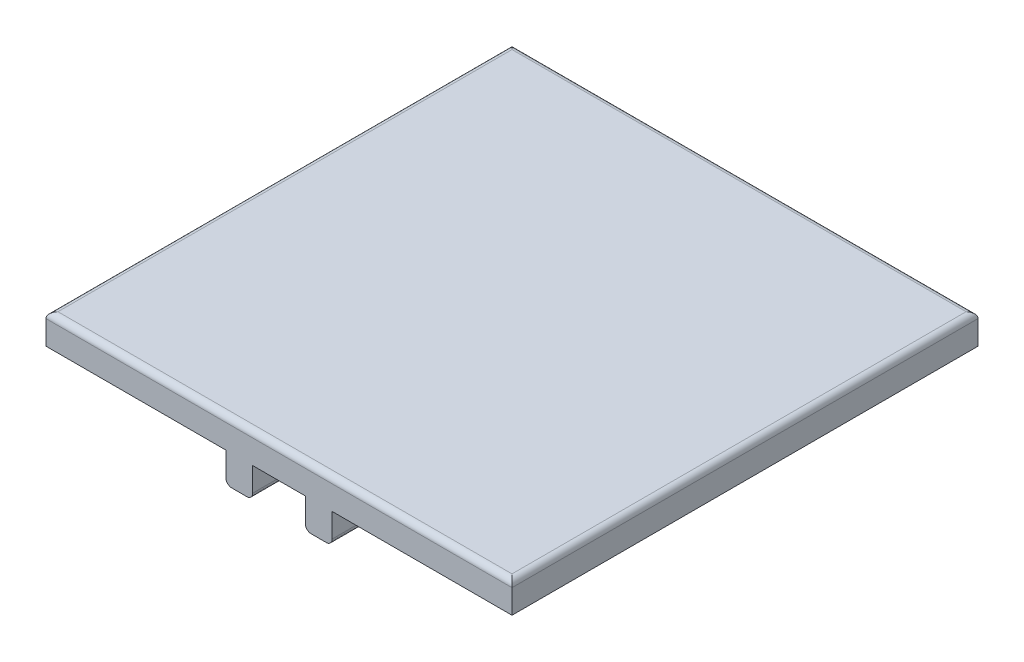
ISO-10303-21;
HEADER;
FILE_DESCRIPTION(('STEP AP214'),'2;1');
FILE_NAME('part.step','',(''),(''),'','','');
FILE_SCHEMA(('AUTOMOTIVE_DESIGN { 1 0 10303 214 1 1 1 1 }'));
ENDSEC;
DATA;
#1=APPLICATION_CONTEXT('core data for automotive mechanical design processes');
#2=APPLICATION_PROTOCOL_DEFINITION('international standard','automotive_design',2000,#1);
#3=PRODUCT_CONTEXT('',#1,'mechanical');
#4=PRODUCT('Part','Part','',(#3));
#5=PRODUCT_RELATED_PRODUCT_CATEGORY('part','',(#4));
#6=PRODUCT_DEFINITION_FORMATION('','',#4);
#7=PRODUCT_DEFINITION_CONTEXT('part definition',#1,'design');
#8=PRODUCT_DEFINITION('design','',#6,#7);
#9=PRODUCT_DEFINITION_SHAPE('','',#8);
#10=(LENGTH_UNIT() NAMED_UNIT(*) SI_UNIT(.MILLI.,.METRE.));
#11=(NAMED_UNIT(*) PLANE_ANGLE_UNIT() SI_UNIT($,.RADIAN.));
#12=(NAMED_UNIT(*) SI_UNIT($,.STERADIAN.) SOLID_ANGLE_UNIT());
#13=UNCERTAINTY_MEASURE_WITH_UNIT(LENGTH_MEASURE(1.E-05),#10,'distance_accuracy_value','');
#14=(GEOMETRIC_REPRESENTATION_CONTEXT(3) GLOBAL_UNCERTAINTY_ASSIGNED_CONTEXT((#13)) GLOBAL_UNIT_ASSIGNED_CONTEXT((#10,
#11,#12)) REPRESENTATION_CONTEXT('',''));
#15=CARTESIAN_POINT('',(0.,0.,0.));
#16=DIRECTION('',(0.,0.,1.));
#17=DIRECTION('',(1.,0.,0.));
#18=AXIS2_PLACEMENT_3D('',#15,#16,#17);
#19=CARTESIAN_POINT('',(39.,0.,39.));
#20=DIRECTION('',(1.,0.,0.));
#21=DIRECTION('',(0.,0.,-1.));
#22=AXIS2_PLACEMENT_3D('',#19,#20,#21);
#23=PLANE('',#22);
#24=DIRECTION('',(0.,-1.,0.));
#25=VECTOR('',#24,1.);
#26=CARTESIAN_POINT('',(39.,0.,-39.));
#27=LINE('',#26,#25);
#28=CARTESIAN_POINT('',(39.,1.5,-39.));
#29=VERTEX_POINT('',#28);
#30=CARTESIAN_POINT('',(39.,-2.5,-39.));
#31=VERTEX_POINT('',#30);
#32=EDGE_CURVE('E223',#29,#31,#27,.T.);
#33=ORIENTED_EDGE('',*,*,#32,.F.);
#34=DIRECTION('',(0.,0.,-1.));
#35=VECTOR('',#34,1.);
#36=CARTESIAN_POINT('',(39.,1.5,39.));
#37=LINE('',#36,#35);
#38=CARTESIAN_POINT('',(39.,1.5,39.));
#39=VERTEX_POINT('',#38);
#40=EDGE_CURVE('E49',#29,#39,#37,.F.);
#41=ORIENTED_EDGE('',*,*,#40,.T.);
#42=DIRECTION('',(0.,-1.,0.));
#43=VECTOR('',#42,1.);
#44=CARTESIAN_POINT('',(39.,0.,39.));
#45=LINE('',#44,#43);
#46=CARTESIAN_POINT('',(39.,-2.5,39.));
#47=VERTEX_POINT('',#46);
#48=EDGE_CURVE('E180',#39,#47,#45,.T.);
#49=ORIENTED_EDGE('',*,*,#48,.T.);
#50=DIRECTION('',(0.,0.,-1.));
#51=VECTOR('',#50,1.);
#52=CARTESIAN_POINT('',(39.,-2.5,39.));
#53=LINE('',#52,#51);
#54=EDGE_CURVE('E202',#47,#31,#53,.T.);
#55=ORIENTED_EDGE('',*,*,#54,.T.);
#56=EDGE_LOOP('',(#33,#41,#49,#55));
#57=FACE_BOUND('',#56,.T.);
#58=ADVANCED_FACE('F40',(#57),#23,.T.);
#59=CARTESIAN_POINT('',(0.,2.5,39.));
#60=DIRECTION('',(0.,1.,0.));
#61=DIRECTION('',(0.,0.,1.));
#62=AXIS2_PLACEMENT_3D('',#59,#60,#61);
#63=PLANE('',#62);
#64=DIRECTION('',(1.,0.,0.));
#65=VECTOR('',#64,1.);
#66=CARTESIAN_POINT('',(0.,2.5,38.));
#67=LINE('',#66,#65);
#68=CARTESIAN_POINT('',(-38.,2.5,38.));
#69=VERTEX_POINT('',#68);
#70=CARTESIAN_POINT('',(38.,2.5,38.));
#71=VERTEX_POINT('',#70);
#72=EDGE_CURVE('E295',#69,#71,#67,.T.);
#73=ORIENTED_EDGE('',*,*,#72,.T.);
#74=DIRECTION('',(0.,0.,-1.));
#75=VECTOR('',#74,1.);
#76=CARTESIAN_POINT('',(38.,2.5,39.));
#77=LINE('',#76,#75);
#78=CARTESIAN_POINT('',(38.,2.5,-38.));
#79=VERTEX_POINT('',#78);
#80=EDGE_CURVE('E300',#71,#79,#77,.T.);
#81=ORIENTED_EDGE('',*,*,#80,.T.);
#82=DIRECTION('',(1.,0.,0.));
#83=VECTOR('',#82,1.);
#84=CARTESIAN_POINT('',(-39.,2.5,-38.));
#85=LINE('',#84,#83);
#86=CARTESIAN_POINT('',(-38.,2.5,-38.));
#87=VERTEX_POINT('',#86);
#88=EDGE_CURVE('E64',#79,#87,#85,.F.);
#89=ORIENTED_EDGE('',*,*,#88,.T.);
#90=DIRECTION('',(0.,0.,-1.));
#91=VECTOR('',#90,1.);
#92=CARTESIAN_POINT('',(-38.,2.5,39.));
#93=LINE('',#92,#91);
#94=EDGE_CURVE('E297',#87,#69,#93,.F.);
#95=ORIENTED_EDGE('',*,*,#94,.T.);
#96=EDGE_LOOP('',(#73,#81,#89,#95));
#97=FACE_BOUND('',#96,.T.);
#98=ADVANCED_FACE('F374',(#97),#63,.T.);
#99=CARTESIAN_POINT('',(-39.,0.,39.));
#100=DIRECTION('',(1.,0.,0.));
#101=DIRECTION('',(0.,0.,-1.));
#102=AXIS2_PLACEMENT_3D('',#99,#100,#101);
#103=PLANE('',#102);
#104=DIRECTION('',(0.,-1.,0.));
#105=VECTOR('',#104,1.);
#106=CARTESIAN_POINT('',(-39.,0.,39.));
#107=LINE('',#106,#105);
#108=CARTESIAN_POINT('',(-39.,1.5,39.));
#109=VERTEX_POINT('',#108);
#110=CARTESIAN_POINT('',(-39.,-2.5,39.));
#111=VERTEX_POINT('',#110);
#112=EDGE_CURVE('E167',#109,#111,#107,.T.);
#113=ORIENTED_EDGE('',*,*,#112,.F.);
#114=DIRECTION('',(0.,0.,-1.));
#115=VECTOR('',#114,1.);
#116=CARTESIAN_POINT('',(-39.,1.5,-39.));
#117=LINE('',#116,#115);
#118=CARTESIAN_POINT('',(-39.,1.5,-39.));
#119=VERTEX_POINT('',#118);
#120=EDGE_CURVE('E11',#109,#119,#117,.T.);
#121=ORIENTED_EDGE('',*,*,#120,.T.);
#122=DIRECTION('',(0.,-1.,0.));
#123=VECTOR('',#122,1.);
#124=CARTESIAN_POINT('',(-39.,0.,-39.));
#125=LINE('',#124,#123);
#126=CARTESIAN_POINT('',(-39.,-2.5,-39.));
#127=VERTEX_POINT('',#126);
#128=EDGE_CURVE('E186',#119,#127,#125,.T.);
#129=ORIENTED_EDGE('',*,*,#128,.T.);
#130=DIRECTION('',(0.,0.,-1.));
#131=VECTOR('',#130,1.);
#132=CARTESIAN_POINT('',(-39.,-2.5,39.));
#133=LINE('',#132,#131);
#134=EDGE_CURVE('E183',#111,#127,#133,.T.);
#135=ORIENTED_EDGE('',*,*,#134,.F.);
#136=EDGE_LOOP('',(#113,#121,#129,#135));
#137=FACE_BOUND('',#136,.T.);
#138=ADVANCED_FACE('F184',(#137),#103,.F.);
#139=CARTESIAN_POINT('',(0.,-2.5,39.));
#140=DIRECTION('',(0.,1.,0.));
#141=DIRECTION('',(0.,0.,1.));
#142=AXIS2_PLACEMENT_3D('',#139,#140,#141);
#143=PLANE('',#142);
#144=DIRECTION('',(1.,0.,0.));
#145=VECTOR('',#144,1.);
#146=CARTESIAN_POINT('',(0.,-2.5,-39.));
#147=LINE('',#146,#145);
#148=CARTESIAN_POINT('',(-8.9,-2.5,-39.));
#149=VERTEX_POINT('',#148);
#150=EDGE_CURVE('E226',#127,#149,#147,.T.);
#151=ORIENTED_EDGE('',*,*,#150,.T.);
#152=DIRECTION('',(0.,0.,-1.));
#153=VECTOR('',#152,1.);
#154=CARTESIAN_POINT('',(-8.9,-2.5,39.));
#155=LINE('',#154,#153);
#156=CARTESIAN_POINT('',(-8.9,-2.5,39.));
#157=VERTEX_POINT('',#156);
#158=EDGE_CURVE('E190',#157,#149,#155,.T.);
#159=ORIENTED_EDGE('',*,*,#158,.F.);
#160=DIRECTION('',(1.,0.,0.));
#161=VECTOR('',#160,1.);
#162=CARTESIAN_POINT('',(0.,-2.5,39.));
#163=LINE('',#162,#161);
#164=EDGE_CURVE('E173',#111,#157,#163,.T.);
#165=ORIENTED_EDGE('',*,*,#164,.F.);
#166=ORIENTED_EDGE('',*,*,#134,.T.);
#167=EDGE_LOOP('',(#151,#159,#165,#166));
#168=FACE_BOUND('',#167,.T.);
#169=ADVANCED_FACE('F192',(#168),#143,.F.);
#170=CARTESIAN_POINT('',(-8.9,0.,39.));
#171=DIRECTION('',(1.,0.,0.));
#172=DIRECTION('',(0.,1.,0.));
#173=AXIS2_PLACEMENT_3D('',#170,#171,#172);
#174=PLANE('',#173);
#175=DIRECTION('',(0.,-1.,0.));
#176=VECTOR('',#175,1.);
#177=CARTESIAN_POINT('',(-8.9,0.,-39.));
#178=LINE('',#177,#176);
#179=CARTESIAN_POINT('',(-8.9,-6.5,-39.));
#180=VERTEX_POINT('',#179);
#181=EDGE_CURVE('E228',#149,#180,#178,.T.);
#182=ORIENTED_EDGE('',*,*,#181,.T.);
#183=DIRECTION('',(0.,0.,-1.));
#184=VECTOR('',#183,1.);
#185=CARTESIAN_POINT('',(-8.9,-6.5,39.));
#186=LINE('',#185,#184);
#187=CARTESIAN_POINT('',(-8.9,-6.5,39.));
#188=VERTEX_POINT('',#187);
#189=EDGE_CURVE('E293',#180,#188,#186,.F.);
#190=ORIENTED_EDGE('',*,*,#189,.T.);
#191=DIRECTION('',(0.,-1.,0.));
#192=VECTOR('',#191,1.);
#193=CARTESIAN_POINT('',(-8.9,0.,39.));
#194=LINE('',#193,#192);
#195=EDGE_CURVE('E195',#157,#188,#194,.T.);
#196=ORIENTED_EDGE('',*,*,#195,.F.);
#197=ORIENTED_EDGE('',*,*,#158,.T.);
#198=EDGE_LOOP('',(#182,#190,#196,#197));
#199=FACE_BOUND('',#198,.T.);
#200=ADVANCED_FACE('F323',(#199),#174,.F.);
#201=CARTESIAN_POINT('',(0.,-7.5,39.));
#202=DIRECTION('',(0.,1.,0.));
#203=DIRECTION('',(-1.,0.,0.));
#204=AXIS2_PLACEMENT_3D('',#201,#202,#203);
#205=PLANE('',#204);
#206=DIRECTION('',(1.,0.,0.));
#207=VECTOR('',#206,1.);
#208=CARTESIAN_POINT('',(0.,-7.5,-39.));
#209=LINE('',#208,#207);
#210=CARTESIAN_POINT('',(-7.9,-7.5,-39.));
#211=VERTEX_POINT('',#210);
#212=CARTESIAN_POINT('',(-5.4,-7.5,-39.));
#213=VERTEX_POINT('',#212);
#214=EDGE_CURVE('E233',#211,#213,#209,.T.);
#215=ORIENTED_EDGE('',*,*,#214,.T.);
#216=DIRECTION('',(0.,0.,-1.));
#217=VECTOR('',#216,1.);
#218=CARTESIAN_POINT('',(-5.4,-7.5,39.));
#219=LINE('',#218,#217);
#220=CARTESIAN_POINT('',(-5.4,-7.5,39.));
#221=VERTEX_POINT('',#220);
#222=EDGE_CURVE('E272',#213,#221,#219,.F.);
#223=ORIENTED_EDGE('',*,*,#222,.T.);
#224=DIRECTION('',(1.,0.,0.));
#225=VECTOR('',#224,1.);
#226=CARTESIAN_POINT('',(0.,-7.5,39.));
#227=LINE('',#226,#225);
#228=CARTESIAN_POINT('',(-7.9,-7.5,39.));
#229=VERTEX_POINT('',#228);
#230=EDGE_CURVE('E199',#229,#221,#227,.T.);
#231=ORIENTED_EDGE('',*,*,#230,.F.);
#232=DIRECTION('',(0.,0.,-1.));
#233=VECTOR('',#232,1.);
#234=CARTESIAN_POINT('',(-7.9,-7.5,39.));
#235=LINE('',#234,#233);
#236=EDGE_CURVE('E269',#229,#211,#235,.T.);
#237=ORIENTED_EDGE('',*,*,#236,.T.);
#238=EDGE_LOOP('',(#215,#223,#231,#237));
#239=FACE_BOUND('',#238,.T.);
#240=ADVANCED_FACE('F332',(#239),#205,.F.);
#241=CARTESIAN_POINT('',(-4.4,0.,39.));
#242=DIRECTION('',(1.,0.,0.));
#243=DIRECTION('',(0.,0.,-1.));
#244=AXIS2_PLACEMENT_3D('',#241,#242,#243);
#245=PLANE('',#244);
#246=DIRECTION('',(0.,-1.,0.));
#247=VECTOR('',#246,1.);
#248=CARTESIAN_POINT('',(-4.4,0.,39.));
#249=LINE('',#248,#247);
#250=CARTESIAN_POINT('',(-4.4,-2.5,39.));
#251=VERTEX_POINT('',#250);
#252=CARTESIAN_POINT('',(-4.4,-6.5,39.));
#253=VERTEX_POINT('',#252);
#254=EDGE_CURVE('E205',#251,#253,#249,.T.);
#255=ORIENTED_EDGE('',*,*,#254,.T.);
#256=DIRECTION('',(0.,0.,-1.));
#257=VECTOR('',#256,1.);
#258=CARTESIAN_POINT('',(-4.4,-6.5,-39.));
#259=LINE('',#258,#257);
#260=CARTESIAN_POINT('',(-4.4,-6.5,-39.));
#261=VERTEX_POINT('',#260);
#262=EDGE_CURVE('E189',#253,#261,#259,.T.);
#263=ORIENTED_EDGE('',*,*,#262,.T.);
#264=DIRECTION('',(0.,-1.,0.));
#265=VECTOR('',#264,1.);
#266=CARTESIAN_POINT('',(-4.4,0.,-39.));
#267=LINE('',#266,#265);
#268=CARTESIAN_POINT('',(-4.4,-2.5,-39.));
#269=VERTEX_POINT('',#268);
#270=EDGE_CURVE('E236',#269,#261,#267,.T.);
#271=ORIENTED_EDGE('',*,*,#270,.F.);
#272=DIRECTION('',(0.,0.,-1.));
#273=VECTOR('',#272,1.);
#274=CARTESIAN_POINT('',(-4.4,-2.5,39.));
#275=LINE('',#274,#273);
#276=EDGE_CURVE('E255',#251,#269,#275,.T.);
#277=ORIENTED_EDGE('',*,*,#276,.F.);
#278=EDGE_LOOP('',(#255,#263,#271,#277));
#279=FACE_BOUND('',#278,.T.);
#280=ADVANCED_FACE('F339',(#279),#245,.T.);
#281=CARTESIAN_POINT('',(4.4,-2.5,-39.));
#282=VERTEX_POINT('',#281);
#283=EDGE_CURVE('E230',#269,#282,#147,.T.);
#284=ORIENTED_EDGE('',*,*,#283,.T.);
#285=DIRECTION('',(0.,0.,-1.));
#286=VECTOR('',#285,1.);
#287=CARTESIAN_POINT('',(4.4,-2.5,39.));
#288=LINE('',#287,#286);
#289=CARTESIAN_POINT('',(4.4,-2.5,39.));
#290=VERTEX_POINT('',#289);
#291=EDGE_CURVE('E252',#290,#282,#288,.T.);
#292=ORIENTED_EDGE('',*,*,#291,.F.);
#293=EDGE_CURVE('E198',#251,#290,#163,.T.);
#294=ORIENTED_EDGE('',*,*,#293,.F.);
#295=ORIENTED_EDGE('',*,*,#276,.T.);
#296=EDGE_LOOP('',(#284,#292,#294,#295));
#297=FACE_BOUND('',#296,.T.);
#298=ADVANCED_FACE('F341',(#297),#143,.F.);
#299=CARTESIAN_POINT('',(4.4,0.,39.));
#300=DIRECTION('',(1.,0.,0.));
#301=DIRECTION('',(0.,1.,0.));
#302=AXIS2_PLACEMENT_3D('',#299,#300,#301);
#303=PLANE('',#302);
#304=DIRECTION('',(0.,-1.,0.));
#305=VECTOR('',#304,1.);
#306=CARTESIAN_POINT('',(4.4,0.,-39.));
#307=LINE('',#306,#305);
#308=CARTESIAN_POINT('',(4.4,-6.5,-39.));
#309=VERTEX_POINT('',#308);
#310=EDGE_CURVE('E239',#282,#309,#307,.T.);
#311=ORIENTED_EDGE('',*,*,#310,.T.);
#312=DIRECTION('',(0.,0.,-1.));
#313=VECTOR('',#312,1.);
#314=CARTESIAN_POINT('',(4.4,-6.5,39.));
#315=LINE('',#314,#313);
#316=CARTESIAN_POINT('',(4.4,-6.5,39.));
#317=VERTEX_POINT('',#316);
#318=EDGE_CURVE('E288',#309,#317,#315,.F.);
#319=ORIENTED_EDGE('',*,*,#318,.T.);
#320=DIRECTION('',(0.,-1.,0.));
#321=VECTOR('',#320,1.);
#322=CARTESIAN_POINT('',(4.4,0.,39.));
#323=LINE('',#322,#321);
#324=EDGE_CURVE('E204',#290,#317,#323,.T.);
#325=ORIENTED_EDGE('',*,*,#324,.F.);
#326=ORIENTED_EDGE('',*,*,#291,.T.);
#327=EDGE_LOOP('',(#311,#319,#325,#326));
#328=FACE_BOUND('',#327,.T.);
#329=ADVANCED_FACE('F345',(#328),#303,.F.);
#330=CARTESIAN_POINT('',(0.,-7.5,39.));
#331=DIRECTION('',(0.,1.,0.));
#332=DIRECTION('',(-1.,0.,0.));
#333=AXIS2_PLACEMENT_3D('',#330,#331,#332);
#334=PLANE('',#333);
#335=DIRECTION('',(1.,0.,0.));
#336=VECTOR('',#335,1.);
#337=CARTESIAN_POINT('',(0.,-7.5,39.));
#338=LINE('',#337,#336);
#339=CARTESIAN_POINT('',(5.4,-7.5,39.));
#340=VERTEX_POINT('',#339);
#341=CARTESIAN_POINT('',(7.9,-7.5,39.));
#342=VERTEX_POINT('',#341);
#343=EDGE_CURVE('E210',#340,#342,#338,.T.);
#344=ORIENTED_EDGE('',*,*,#343,.F.);
#345=DIRECTION('',(0.,0.,-1.));
#346=VECTOR('',#345,1.);
#347=CARTESIAN_POINT('',(5.4,-7.5,39.));
#348=LINE('',#347,#346);
#349=CARTESIAN_POINT('',(5.4,-7.5,-39.));
#350=VERTEX_POINT('',#349);
#351=EDGE_CURVE('E285',#340,#350,#348,.T.);
#352=ORIENTED_EDGE('',*,*,#351,.T.);
#353=DIRECTION('',(1.,0.,0.));
#354=VECTOR('',#353,1.);
#355=CARTESIAN_POINT('',(0.,-7.5,-39.));
#356=LINE('',#355,#354);
#357=CARTESIAN_POINT('',(7.9,-7.5,-39.));
#358=VERTEX_POINT('',#357);
#359=EDGE_CURVE('E242',#350,#358,#356,.T.);
#360=ORIENTED_EDGE('',*,*,#359,.T.);
#361=DIRECTION('',(0.,0.,-1.));
#362=VECTOR('',#361,1.);
#363=CARTESIAN_POINT('',(7.9,-7.5,39.));
#364=LINE('',#363,#362);
#365=EDGE_CURVE('E283',#358,#342,#364,.F.);
#366=ORIENTED_EDGE('',*,*,#365,.T.);
#367=EDGE_LOOP('',(#344,#352,#360,#366));
#368=FACE_BOUND('',#367,.T.);
#369=ADVANCED_FACE('F354',(#368),#334,.F.);
#370=CARTESIAN_POINT('',(8.9,0.,39.));
#371=DIRECTION('',(1.,0.,0.));
#372=DIRECTION('',(0.,0.,-1.));
#373=AXIS2_PLACEMENT_3D('',#370,#371,#372);
#374=PLANE('',#373);
#375=DIRECTION('',(0.,-1.,0.));
#376=VECTOR('',#375,1.);
#377=CARTESIAN_POINT('',(8.9,0.,39.));
#378=LINE('',#377,#376);
#379=CARTESIAN_POINT('',(8.9,-2.5,39.));
#380=VERTEX_POINT('',#379);
#381=CARTESIAN_POINT('',(8.9,-6.5,39.));
#382=VERTEX_POINT('',#381);
#383=EDGE_CURVE('E203',#380,#382,#378,.T.);
#384=ORIENTED_EDGE('',*,*,#383,.T.);
#385=DIRECTION('',(0.,0.,-1.));
#386=VECTOR('',#385,1.);
#387=CARTESIAN_POINT('',(8.9,-6.5,-39.));
#388=LINE('',#387,#386);
#389=CARTESIAN_POINT('',(8.9,-6.5,-39.));
#390=VERTEX_POINT('',#389);
#391=EDGE_CURVE('E290',#382,#390,#388,.T.);
#392=ORIENTED_EDGE('',*,*,#391,.T.);
#393=DIRECTION('',(0.,-1.,0.));
#394=VECTOR('',#393,1.);
#395=CARTESIAN_POINT('',(8.9,0.,-39.));
#396=LINE('',#395,#394);
#397=CARTESIAN_POINT('',(8.9,-2.5,-39.));
#398=VERTEX_POINT('',#397);
#399=EDGE_CURVE('E245',#398,#390,#396,.T.);
#400=ORIENTED_EDGE('',*,*,#399,.F.);
#401=DIRECTION('',(0.,0.,-1.));
#402=VECTOR('',#401,1.);
#403=CARTESIAN_POINT('',(8.9,-2.5,39.));
#404=LINE('',#403,#402);
#405=EDGE_CURVE('E250',#380,#398,#404,.T.);
#406=ORIENTED_EDGE('',*,*,#405,.F.);
#407=EDGE_LOOP('',(#384,#392,#400,#406));
#408=FACE_BOUND('',#407,.T.);
#409=ADVANCED_FACE('F363',(#408),#374,.T.);
#410=EDGE_CURVE('E229',#398,#31,#147,.T.);
#411=ORIENTED_EDGE('',*,*,#410,.T.);
#412=ORIENTED_EDGE('',*,*,#54,.F.);
#413=EDGE_CURVE('E197',#380,#47,#163,.T.);
#414=ORIENTED_EDGE('',*,*,#413,.F.);
#415=ORIENTED_EDGE('',*,*,#405,.T.);
#416=EDGE_LOOP('',(#411,#412,#414,#415));
#417=FACE_BOUND('',#416,.T.);
#418=ADVANCED_FACE('F369',(#417),#143,.F.);
#419=CARTESIAN_POINT('',(0.,0.,39.));
#420=DIRECTION('',(0.,0.,1.));
#421=DIRECTION('',(1.,0.,0.));
#422=AXIS2_PLACEMENT_3D('',#419,#420,#421);
#423=PLANE('',#422);
#424=ORIENTED_EDGE('',*,*,#230,.T.);
#425=CARTESIAN_POINT('',(-5.4,-6.5,39.));
#426=DIRECTION('',(0.,0.,1.));
#427=DIRECTION('',(1.,0.,0.));
#428=AXIS2_PLACEMENT_3D('',#425,#426,#427);
#429=CIRCLE('',#428,1.);
#430=EDGE_CURVE('E281',#221,#253,#429,.T.);
#431=ORIENTED_EDGE('',*,*,#430,.T.);
#432=ORIENTED_EDGE('',*,*,#254,.F.);
#433=ORIENTED_EDGE('',*,*,#293,.T.);
#434=ORIENTED_EDGE('',*,*,#324,.T.);
#435=CARTESIAN_POINT('',(5.4,-6.5,39.));
#436=DIRECTION('',(0.,0.,1.));
#437=DIRECTION('',(1.,0.,0.));
#438=AXIS2_PLACEMENT_3D('',#435,#436,#437);
#439=CIRCLE('',#438,1.);
#440=EDGE_CURVE('E279',#317,#340,#439,.T.);
#441=ORIENTED_EDGE('',*,*,#440,.T.);
#442=ORIENTED_EDGE('',*,*,#343,.T.);
#443=CARTESIAN_POINT('',(7.9,-6.5,39.));
#444=DIRECTION('',(0.,0.,1.));
#445=DIRECTION('',(1.,0.,0.));
#446=AXIS2_PLACEMENT_3D('',#443,#444,#445);
#447=CIRCLE('',#446,1.);
#448=EDGE_CURVE('E277',#342,#382,#447,.T.);
#449=ORIENTED_EDGE('',*,*,#448,.T.);
#450=ORIENTED_EDGE('',*,*,#383,.F.);
#451=ORIENTED_EDGE('',*,*,#413,.T.);
#452=ORIENTED_EDGE('',*,*,#48,.F.);
#453=DIRECTION('',(1.,0.,0.));
#454=VECTOR('',#453,1.);
#455=CARTESIAN_POINT('',(0.,1.5,39.));
#456=LINE('',#455,#454);
#457=EDGE_CURVE('E177',#39,#109,#456,.F.);
#458=ORIENTED_EDGE('',*,*,#457,.T.);
#459=ORIENTED_EDGE('',*,*,#112,.T.);
#460=ORIENTED_EDGE('',*,*,#164,.T.);
#461=ORIENTED_EDGE('',*,*,#195,.T.);
#462=CARTESIAN_POINT('',(-7.9,-6.5,39.));
#463=DIRECTION('',(0.,0.,1.));
#464=DIRECTION('',(1.,0.,0.));
#465=AXIS2_PLACEMENT_3D('',#462,#463,#464);
#466=CIRCLE('',#465,1.);
#467=EDGE_CURVE('E275',#188,#229,#466,.T.);
#468=ORIENTED_EDGE('',*,*,#467,.T.);
#469=EDGE_LOOP('',(#424,#431,#432,#433,#434,#441,#442,#449,#450,#451,#452,#458,#459,#460,#461,#468));
#470=FACE_BOUND('',#469,.T.);
#471=ADVANCED_FACE('F170',(#470),#423,.T.);
#472=CARTESIAN_POINT('',(0.,0.,-39.));
#473=DIRECTION('',(0.,0.,1.));
#474=DIRECTION('',(1.,0.,0.));
#475=AXIS2_PLACEMENT_3D('',#472,#473,#474);
#476=PLANE('',#475);
#477=ORIENTED_EDGE('',*,*,#270,.T.);
#478=CARTESIAN_POINT('',(-5.4,-6.5,-39.));
#479=DIRECTION('',(0.,0.,1.));
#480=DIRECTION('',(1.,0.,0.));
#481=AXIS2_PLACEMENT_3D('',#478,#479,#480);
#482=CIRCLE('',#481,1.);
#483=EDGE_CURVE('E267',#261,#213,#482,.F.);
#484=ORIENTED_EDGE('',*,*,#483,.T.);
#485=ORIENTED_EDGE('',*,*,#214,.F.);
#486=CARTESIAN_POINT('',(-7.9,-6.5,-39.));
#487=DIRECTION('',(0.,0.,1.));
#488=DIRECTION('',(1.,0.,0.));
#489=AXIS2_PLACEMENT_3D('',#486,#487,#488);
#490=CIRCLE('',#489,1.);
#491=EDGE_CURVE('E261',#211,#180,#490,.F.);
#492=ORIENTED_EDGE('',*,*,#491,.T.);
#493=ORIENTED_EDGE('',*,*,#181,.F.);
#494=ORIENTED_EDGE('',*,*,#150,.F.);
#495=ORIENTED_EDGE('',*,*,#128,.F.);
#496=DIRECTION('',(1.,0.,0.));
#497=VECTOR('',#496,1.);
#498=CARTESIAN_POINT('',(39.,1.5,-39.));
#499=LINE('',#498,#497);
#500=EDGE_CURVE('E259',#119,#29,#499,.T.);
#501=ORIENTED_EDGE('',*,*,#500,.T.);
#502=ORIENTED_EDGE('',*,*,#32,.T.);
#503=ORIENTED_EDGE('',*,*,#410,.F.);
#504=ORIENTED_EDGE('',*,*,#399,.T.);
#505=CARTESIAN_POINT('',(7.9,-6.5,-39.));
#506=DIRECTION('',(0.,0.,1.));
#507=DIRECTION('',(1.,0.,0.));
#508=AXIS2_PLACEMENT_3D('',#505,#506,#507);
#509=CIRCLE('',#508,1.);
#510=EDGE_CURVE('E263',#390,#358,#509,.F.);
#511=ORIENTED_EDGE('',*,*,#510,.T.);
#512=ORIENTED_EDGE('',*,*,#359,.F.);
#513=CARTESIAN_POINT('',(5.4,-6.5,-39.));
#514=DIRECTION('',(0.,0.,1.));
#515=DIRECTION('',(1.,0.,0.));
#516=AXIS2_PLACEMENT_3D('',#513,#514,#515);
#517=CIRCLE('',#516,1.);
#518=EDGE_CURVE('E265',#350,#309,#517,.F.);
#519=ORIENTED_EDGE('',*,*,#518,.T.);
#520=ORIENTED_EDGE('',*,*,#310,.F.);
#521=ORIENTED_EDGE('',*,*,#283,.F.);
#522=EDGE_LOOP('',(#477,#484,#485,#492,#493,#494,#495,#501,#502,#503,#504,#511,#512,#519,#520,#521));
#523=FACE_BOUND('',#522,.T.);
#524=ADVANCED_FACE('F319',(#523),#476,.F.);
#525=CARTESIAN_POINT('',(-5.4,-6.5,39.));
#526=DIRECTION('',(0.,0.,1.));
#527=DIRECTION('',(1.,0.,0.));
#528=AXIS2_PLACEMENT_3D('',#525,#526,#527);
#529=CYLINDRICAL_SURFACE('',#528,1.);
#530=ORIENTED_EDGE('',*,*,#430,.F.);
#531=ORIENTED_EDGE('',*,*,#222,.F.);
#532=ORIENTED_EDGE('',*,*,#483,.F.);
#533=ORIENTED_EDGE('',*,*,#262,.F.);
#534=EDGE_LOOP('',(#530,#531,#532,#533));
#535=FACE_BOUND('',#534,.T.);
#536=ADVANCED_FACE('F338',(#535),#529,.T.);
#537=CARTESIAN_POINT('',(5.4,-6.5,39.));
#538=DIRECTION('',(0.,0.,-1.));
#539=DIRECTION('',(-1.,0.,0.));
#540=AXIS2_PLACEMENT_3D('',#537,#538,#539);
#541=CYLINDRICAL_SURFACE('',#540,1.);
#542=ORIENTED_EDGE('',*,*,#440,.F.);
#543=ORIENTED_EDGE('',*,*,#318,.F.);
#544=ORIENTED_EDGE('',*,*,#518,.F.);
#545=ORIENTED_EDGE('',*,*,#351,.F.);
#546=EDGE_LOOP('',(#542,#543,#544,#545));
#547=FACE_BOUND('',#546,.T.);
#548=ADVANCED_FACE('F351',(#547),#541,.T.);
#549=CARTESIAN_POINT('',(7.9,-6.5,39.));
#550=DIRECTION('',(0.,0.,1.));
#551=DIRECTION('',(1.,0.,0.));
#552=AXIS2_PLACEMENT_3D('',#549,#550,#551);
#553=CYLINDRICAL_SURFACE('',#552,1.);
#554=ORIENTED_EDGE('',*,*,#448,.F.);
#555=ORIENTED_EDGE('',*,*,#365,.F.);
#556=ORIENTED_EDGE('',*,*,#510,.F.);
#557=ORIENTED_EDGE('',*,*,#391,.F.);
#558=EDGE_LOOP('',(#554,#555,#556,#557));
#559=FACE_BOUND('',#558,.T.);
#560=ADVANCED_FACE('F361',(#559),#553,.T.);
#561=CARTESIAN_POINT('',(-7.9,-6.5,39.));
#562=DIRECTION('',(0.,0.,-1.));
#563=DIRECTION('',(-1.,0.,0.));
#564=AXIS2_PLACEMENT_3D('',#561,#562,#563);
#565=CYLINDRICAL_SURFACE('',#564,1.);
#566=ORIENTED_EDGE('',*,*,#467,.F.);
#567=ORIENTED_EDGE('',*,*,#189,.F.);
#568=ORIENTED_EDGE('',*,*,#491,.F.);
#569=ORIENTED_EDGE('',*,*,#236,.F.);
#570=EDGE_LOOP('',(#566,#567,#568,#569));
#571=FACE_BOUND('',#570,.T.);
#572=ADVANCED_FACE('F329',(#571),#565,.T.);
#573=CARTESIAN_POINT('',(-38.,1.5,39.));
#574=DIRECTION('',(0.,0.,1.));
#575=DIRECTION('',(1.,0.,0.));
#576=AXIS2_PLACEMENT_3D('',#573,#574,#575);
#577=CYLINDRICAL_SURFACE('',#576,1.);
#578=CARTESIAN_POINT('',(-38.,1.5,-38.));
#579=DIRECTION('',(-0.707106781186547,0.,0.707106781186547));
#580=DIRECTION('',(0.707106781186547,0.,0.707106781186547));
#581=AXIS2_PLACEMENT_3D('',#578,#579,#580);
#582=ELLIPSE('',#581,1.41421356237309,1.);
#583=EDGE_CURVE('E306',#119,#87,#582,.F.);
#584=ORIENTED_EDGE('',*,*,#583,.F.);
#585=ORIENTED_EDGE('',*,*,#120,.F.);
#586=CARTESIAN_POINT('',(-38.,1.5,38.));
#587=DIRECTION('',(0.707106781186547,0.,0.707106781186547));
#588=DIRECTION('',(0.707106781186547,0.,-0.707106781186547));
#589=AXIS2_PLACEMENT_3D('',#586,#587,#588);
#590=ELLIPSE('',#589,1.41421356237309,1.);
#591=EDGE_CURVE('E44',#69,#109,#590,.T.);
#592=ORIENTED_EDGE('',*,*,#591,.F.);
#593=ORIENTED_EDGE('',*,*,#94,.F.);
#594=EDGE_LOOP('',(#584,#585,#592,#593));
#595=FACE_BOUND('',#594,.T.);
#596=ADVANCED_FACE('F42',(#595),#577,.T.);
#597=CARTESIAN_POINT('',(0.,1.5,38.));
#598=DIRECTION('',(1.,0.,0.));
#599=DIRECTION('',(0.,0.,-1.));
#600=AXIS2_PLACEMENT_3D('',#597,#598,#599);
#601=CYLINDRICAL_SURFACE('',#600,1.);
#602=ORIENTED_EDGE('',*,*,#591,.T.);
#603=ORIENTED_EDGE('',*,*,#457,.F.);
#604=CARTESIAN_POINT('',(38.,1.5,38.));
#605=DIRECTION('',(0.707106781186547,0.,-0.707106781186547));
#606=DIRECTION('',(0.707106781186547,0.,0.707106781186547));
#607=AXIS2_PLACEMENT_3D('',#604,#605,#606);
#608=ELLIPSE('',#607,1.41421356237309,1.);
#609=EDGE_CURVE('E305',#71,#39,#608,.T.);
#610=ORIENTED_EDGE('',*,*,#609,.F.);
#611=ORIENTED_EDGE('',*,*,#72,.F.);
#612=EDGE_LOOP('',(#602,#603,#610,#611));
#613=FACE_BOUND('',#612,.T.);
#614=ADVANCED_FACE('F315',(#613),#601,.T.);
#615=CARTESIAN_POINT('',(0.,1.5,-38.));
#616=DIRECTION('',(-1.,0.,0.));
#617=DIRECTION('',(0.,0.,1.));
#618=AXIS2_PLACEMENT_3D('',#615,#616,#617);
#619=CYLINDRICAL_SURFACE('',#618,1.);
#620=ORIENTED_EDGE('',*,*,#583,.T.);
#621=ORIENTED_EDGE('',*,*,#88,.F.);
#622=CARTESIAN_POINT('',(38.,1.5,-38.));
#623=DIRECTION('',(-0.707106781186547,0.,-0.707106781186547));
#624=DIRECTION('',(-0.707106781186547,0.,0.707106781186547));
#625=AXIS2_PLACEMENT_3D('',#622,#623,#624);
#626=ELLIPSE('',#625,1.41421356237309,1.);
#627=EDGE_CURVE('E57',#29,#79,#626,.F.);
#628=ORIENTED_EDGE('',*,*,#627,.F.);
#629=ORIENTED_EDGE('',*,*,#500,.F.);
#630=EDGE_LOOP('',(#620,#621,#628,#629));
#631=FACE_BOUND('',#630,.T.);
#632=ADVANCED_FACE('F373',(#631),#619,.T.);
#633=CARTESIAN_POINT('',(38.,1.5,39.));
#634=DIRECTION('',(0.,0.,-1.));
#635=DIRECTION('',(-1.,0.,0.));
#636=AXIS2_PLACEMENT_3D('',#633,#634,#635);
#637=CYLINDRICAL_SURFACE('',#636,1.);
#638=ORIENTED_EDGE('',*,*,#609,.T.);
#639=ORIENTED_EDGE('',*,*,#40,.F.);
#640=ORIENTED_EDGE('',*,*,#627,.T.);
#641=ORIENTED_EDGE('',*,*,#80,.F.);
#642=EDGE_LOOP('',(#638,#639,#640,#641));
#643=FACE_BOUND('',#642,.T.);
#644=ADVANCED_FACE('F372',(#643),#637,.T.);
#645=CLOSED_SHELL('',(#58,#98,#138,#169,#200,#240,#280,#298,#329,#369,#409,#418,#471,#524,#536,
#548,#560,#572,#596,#614,#632,#644));
#646=MANIFOLD_SOLID_BREP('B2',#645);
#647=ADVANCED_BREP_SHAPE_REPRESENTATION('',(#18,#646),#14);
#648=SHAPE_DEFINITION_REPRESENTATION(#9,#647);
ENDSEC;
END-ISO-10303-21;
